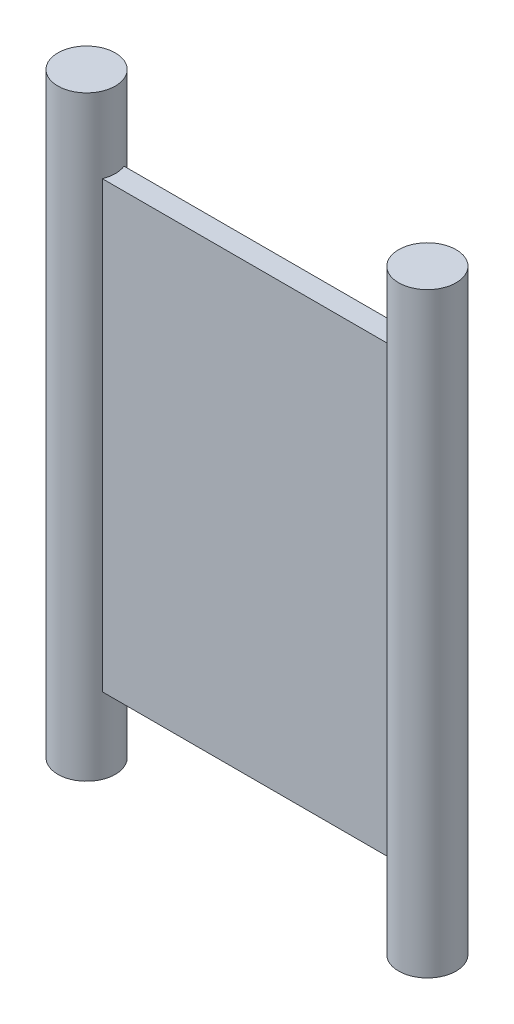
ISO-10303-21;
HEADER;
FILE_DESCRIPTION(('STEP AP214'),'2;1');
FILE_NAME('part.step','',(''),(''),'','','');
FILE_SCHEMA(('AUTOMOTIVE_DESIGN { 1 0 10303 214 1 1 1 1 }'));
ENDSEC;
DATA;
#1=APPLICATION_CONTEXT('core data for automotive mechanical design processes');
#2=APPLICATION_PROTOCOL_DEFINITION('international standard','automotive_design',2000,#1);
#3=PRODUCT_CONTEXT('',#1,'mechanical');
#4=PRODUCT('Part','Part','',(#3));
#5=PRODUCT_RELATED_PRODUCT_CATEGORY('part','',(#4));
#6=PRODUCT_DEFINITION_FORMATION('','',#4);
#7=PRODUCT_DEFINITION_CONTEXT('part definition',#1,'design');
#8=PRODUCT_DEFINITION('design','',#6,#7);
#9=PRODUCT_DEFINITION_SHAPE('','',#8);
#10=(LENGTH_UNIT() NAMED_UNIT(*) SI_UNIT(.MILLI.,.METRE.));
#11=(NAMED_UNIT(*) PLANE_ANGLE_UNIT() SI_UNIT($,.RADIAN.));
#12=(NAMED_UNIT(*) SI_UNIT($,.STERADIAN.) SOLID_ANGLE_UNIT());
#13=UNCERTAINTY_MEASURE_WITH_UNIT(LENGTH_MEASURE(1.E-05),#10,'distance_accuracy_value','');
#14=(GEOMETRIC_REPRESENTATION_CONTEXT(3) GLOBAL_UNCERTAINTY_ASSIGNED_CONTEXT((#13)) GLOBAL_UNIT_ASSIGNED_CONTEXT((#10,
#11,#12)) REPRESENTATION_CONTEXT('',''));
#15=CARTESIAN_POINT('',(0.,0.,0.));
#16=DIRECTION('',(0.,0.,1.));
#17=DIRECTION('',(1.,0.,0.));
#18=AXIS2_PLACEMENT_3D('',#15,#16,#17);
#19=CARTESIAN_POINT('',(7.86,20.5,0.499999999999999));
#20=DIRECTION('',(0.,0.,-1.));
#21=DIRECTION('',(-1.,0.,0.));
#22=AXIS2_PLACEMENT_3D('',#19,#20,#21);
#23=PLANE('',#22);
#24=DIRECTION('',(0.,-1.,0.));
#25=VECTOR('',#24,1.);
#26=CARTESIAN_POINT('',(6.6329608808192,24.,0.499999999999999));
#27=LINE('',#26,#25);
#28=CARTESIAN_POINT('',(6.6329608808192,20.5,0.499999999999999));
#29=VERTEX_POINT('',#28);
#30=CARTESIAN_POINT('',(6.6329608808192,0.,0.499999999999999));
#31=VERTEX_POINT('',#30);
#32=EDGE_CURVE('E53',#29,#31,#27,.T.);
#33=ORIENTED_EDGE('',*,*,#32,.F.);
#34=DIRECTION('',(1.,0.,0.));
#35=VECTOR('',#34,1.);
#36=CARTESIAN_POINT('',(7.86,20.5,0.499999999999999));
#37=LINE('',#36,#35);
#38=CARTESIAN_POINT('',(-6.6329608808192,20.5,0.500000000000001));
#39=VERTEX_POINT('',#38);
#40=EDGE_CURVE('E90',#39,#29,#37,.T.);
#41=ORIENTED_EDGE('',*,*,#40,.F.);
#42=DIRECTION('',(0.,-1.,0.));
#43=VECTOR('',#42,1.);
#44=CARTESIAN_POINT('',(-6.6329608808192,24.,0.500000000000001));
#45=LINE('',#44,#43);
#46=CARTESIAN_POINT('',(-6.6329608808192,0.,0.500000000000001));
#47=VERTEX_POINT('',#46);
#48=EDGE_CURVE('E103',#47,#39,#45,.F.);
#49=ORIENTED_EDGE('',*,*,#48,.F.);
#50=DIRECTION('',(1.,0.,0.));
#51=VECTOR('',#50,1.);
#52=CARTESIAN_POINT('',(7.86,0.,0.499999999999999));
#53=LINE('',#52,#51);
#54=EDGE_CURVE('E91',#47,#31,#53,.T.);
#55=ORIENTED_EDGE('',*,*,#54,.T.);
#56=EDGE_LOOP('',(#33,#41,#49,#55));
#57=FACE_BOUND('',#56,.T.);
#58=ADVANCED_FACE('F39',(#57),#23,.F.);
#59=CARTESIAN_POINT('',(7.86,20.5,-0.500000000000001));
#60=DIRECTION('',(0.,0.,1.));
#61=DIRECTION('',(1.,0.,0.));
#62=AXIS2_PLACEMENT_3D('',#59,#60,#61);
#63=PLANE('',#62);
#64=DIRECTION('',(0.,-1.,0.));
#65=VECTOR('',#64,1.);
#66=CARTESIAN_POINT('',(6.6329608808192,24.,-0.500000000000001));
#67=LINE('',#66,#65);
#68=CARTESIAN_POINT('',(6.6329608808192,0.,-0.500000000000001));
#69=VERTEX_POINT('',#68);
#70=CARTESIAN_POINT('',(6.6329608808192,20.5,-0.500000000000001));
#71=VERTEX_POINT('',#70);
#72=EDGE_CURVE('E78',#69,#71,#67,.F.);
#73=ORIENTED_EDGE('',*,*,#72,.F.);
#74=DIRECTION('',(-1.,0.,0.));
#75=VECTOR('',#74,1.);
#76=CARTESIAN_POINT('',(7.86,0.,-0.500000000000001));
#77=LINE('',#76,#75);
#78=CARTESIAN_POINT('',(-6.63296088081919,0.,-0.499999999999999));
#79=VERTEX_POINT('',#78);
#80=EDGE_CURVE('E60',#69,#79,#77,.T.);
#81=ORIENTED_EDGE('',*,*,#80,.T.);
#82=DIRECTION('',(0.,-1.,0.));
#83=VECTOR('',#82,1.);
#84=CARTESIAN_POINT('',(-6.63296088081919,24.,-0.499999999999999));
#85=LINE('',#84,#83);
#86=CARTESIAN_POINT('',(-6.63296088081919,20.5,-0.499999999999999));
#87=VERTEX_POINT('',#86);
#88=EDGE_CURVE('E105',#87,#79,#85,.T.);
#89=ORIENTED_EDGE('',*,*,#88,.F.);
#90=DIRECTION('',(-1.,0.,0.));
#91=VECTOR('',#90,1.);
#92=CARTESIAN_POINT('',(7.86,20.5,-0.500000000000001));
#93=LINE('',#92,#91);
#94=EDGE_CURVE('E85',#71,#87,#93,.T.);
#95=ORIENTED_EDGE('',*,*,#94,.F.);
#96=EDGE_LOOP('',(#73,#81,#89,#95));
#97=FACE_BOUND('',#96,.T.);
#98=ADVANCED_FACE('F84',(#97),#63,.F.);
#99=CARTESIAN_POINT('',(-7.86,24.,0.));
#100=DIRECTION('',(0.,-1.,0.));
#101=DIRECTION('',(0.,0.,-1.));
#102=AXIS2_PLACEMENT_3D('',#99,#100,#101);
#103=CYLINDRICAL_SURFACE('',#102,1.325);
#104=CARTESIAN_POINT('',(-7.86,24.,0.));
#105=DIRECTION('',(0.,1.,0.));
#106=DIRECTION('',(0.,0.,1.));
#107=AXIS2_PLACEMENT_3D('',#104,#105,#106);
#108=CIRCLE('',#107,1.325);
#109=CARTESIAN_POINT('',(-7.86,24.,1.325));
#110=VERTEX_POINT('',#109);
#111=EDGE_CURVE('E107',#110,#110,#108,.T.);
#112=ORIENTED_EDGE('',*,*,#111,.F.);
#113=EDGE_LOOP('',(#112));
#114=FACE_BOUND('',#113,.T.);
#115=CARTESIAN_POINT('',(-7.86,-3.5,0.));
#116=DIRECTION('',(0.,1.,0.));
#117=DIRECTION('',(0.,0.,1.));
#118=AXIS2_PLACEMENT_3D('',#115,#116,#117);
#119=CIRCLE('',#118,1.325);
#120=CARTESIAN_POINT('',(-7.86,-3.5,1.325));
#121=VERTEX_POINT('',#120);
#122=EDGE_CURVE('E108',#121,#121,#119,.T.);
#123=ORIENTED_EDGE('',*,*,#122,.T.);
#124=EDGE_LOOP('',(#123));
#125=FACE_BOUND('',#124,.T.);
#126=ORIENTED_EDGE('',*,*,#48,.T.);
#127=CARTESIAN_POINT('',(-7.86,20.5,0.));
#128=DIRECTION('',(0.,-1.,0.));
#129=DIRECTION('',(0.,0.,-1.));
#130=AXIS2_PLACEMENT_3D('',#127,#128,#129);
#131=CIRCLE('',#130,1.325);
#132=EDGE_CURVE('E95',#39,#87,#131,.F.);
#133=ORIENTED_EDGE('',*,*,#132,.T.);
#134=ORIENTED_EDGE('',*,*,#88,.T.);
#135=CARTESIAN_POINT('',(-7.86,0.,0.));
#136=DIRECTION('',(0.,-1.,0.));
#137=DIRECTION('',(0.,0.,-1.));
#138=AXIS2_PLACEMENT_3D('',#135,#136,#137);
#139=CIRCLE('',#138,1.325);
#140=EDGE_CURVE('E46',#47,#79,#139,.F.);
#141=ORIENTED_EDGE('',*,*,#140,.F.);
#142=EDGE_LOOP('',(#126,#133,#134,#141));
#143=FACE_BOUND('',#142,.T.);
#144=ADVANCED_FACE('F138',(#114,#125,#143),#103,.T.);
#145=CARTESIAN_POINT('',(-7.86,24.,0.));
#146=DIRECTION('',(0.,1.,0.));
#147=DIRECTION('',(0.,0.,1.));
#148=AXIS2_PLACEMENT_3D('',#145,#146,#147);
#149=PLANE('',#148);
#150=ORIENTED_EDGE('',*,*,#111,.T.);
#151=EDGE_LOOP('',(#150));
#152=FACE_BOUND('',#151,.T.);
#153=ADVANCED_FACE('F144',(#152),#149,.T.);
#154=CARTESIAN_POINT('',(-7.86,-3.5,0.));
#155=DIRECTION('',(0.,1.,0.));
#156=DIRECTION('',(0.,0.,1.));
#157=AXIS2_PLACEMENT_3D('',#154,#155,#156);
#158=PLANE('',#157);
#159=ORIENTED_EDGE('',*,*,#122,.F.);
#160=EDGE_LOOP('',(#159));
#161=FACE_BOUND('',#160,.T.);
#162=ADVANCED_FACE('F150',(#161),#158,.F.);
#163=CARTESIAN_POINT('',(0.,20.5,0.));
#164=DIRECTION('',(0.,-1.,0.));
#165=DIRECTION('',(0.,0.,-1.));
#166=AXIS2_PLACEMENT_3D('',#163,#164,#165);
#167=PLANE('',#166);
#168=CARTESIAN_POINT('',(7.86,20.5,0.));
#169=DIRECTION('',(0.,-1.,0.));
#170=DIRECTION('',(0.,0.,-1.));
#171=AXIS2_PLACEMENT_3D('',#168,#169,#170);
#172=CIRCLE('',#171,1.325);
#173=EDGE_CURVE('E111',#71,#29,#172,.F.);
#174=ORIENTED_EDGE('',*,*,#173,.F.);
#175=ORIENTED_EDGE('',*,*,#94,.T.);
#176=ORIENTED_EDGE('',*,*,#132,.F.);
#177=ORIENTED_EDGE('',*,*,#40,.T.);
#178=EDGE_LOOP('',(#174,#175,#176,#177));
#179=FACE_BOUND('',#178,.T.);
#180=ADVANCED_FACE('F141',(#179),#167,.F.);
#181=CARTESIAN_POINT('',(0.,0.,0.));
#182=DIRECTION('',(0.,-1.,0.));
#183=DIRECTION('',(0.,0.,-1.));
#184=AXIS2_PLACEMENT_3D('',#181,#182,#183);
#185=PLANE('',#184);
#186=ORIENTED_EDGE('',*,*,#80,.F.);
#187=CARTESIAN_POINT('',(7.86,0.,0.));
#188=DIRECTION('',(0.,-1.,0.));
#189=DIRECTION('',(0.,0.,-1.));
#190=AXIS2_PLACEMENT_3D('',#187,#188,#189);
#191=CIRCLE('',#190,1.325);
#192=EDGE_CURVE('E11',#69,#31,#191,.F.);
#193=ORIENTED_EDGE('',*,*,#192,.T.);
#194=ORIENTED_EDGE('',*,*,#54,.F.);
#195=ORIENTED_EDGE('',*,*,#140,.T.);
#196=EDGE_LOOP('',(#186,#193,#194,#195));
#197=FACE_BOUND('',#196,.T.);
#198=ADVANCED_FACE('F89',(#197),#185,.T.);
#199=CARTESIAN_POINT('',(7.86,24.,0.));
#200=DIRECTION('',(0.,-1.,0.));
#201=DIRECTION('',(0.,0.,-1.));
#202=AXIS2_PLACEMENT_3D('',#199,#200,#201);
#203=CYLINDRICAL_SURFACE('',#202,1.325);
#204=CARTESIAN_POINT('',(7.86,24.,0.));
#205=DIRECTION('',(0.,1.,0.));
#206=DIRECTION('',(0.,0.,1.));
#207=AXIS2_PLACEMENT_3D('',#204,#205,#206);
#208=CIRCLE('',#207,1.325);
#209=CARTESIAN_POINT('',(7.86,24.,1.325));
#210=VERTEX_POINT('',#209);
#211=EDGE_CURVE('E116',#210,#210,#208,.T.);
#212=ORIENTED_EDGE('',*,*,#211,.F.);
#213=EDGE_LOOP('',(#212));
#214=FACE_BOUND('',#213,.T.);
#215=CARTESIAN_POINT('',(7.86,-3.5,0.));
#216=DIRECTION('',(0.,1.,0.));
#217=DIRECTION('',(0.,0.,1.));
#218=AXIS2_PLACEMENT_3D('',#215,#216,#217);
#219=CIRCLE('',#218,1.325);
#220=CARTESIAN_POINT('',(7.86,-3.5,1.325));
#221=VERTEX_POINT('',#220);
#222=EDGE_CURVE('E86',#221,#221,#219,.T.);
#223=ORIENTED_EDGE('',*,*,#222,.T.);
#224=EDGE_LOOP('',(#223));
#225=FACE_BOUND('',#224,.T.);
#226=ORIENTED_EDGE('',*,*,#72,.T.);
#227=ORIENTED_EDGE('',*,*,#173,.T.);
#228=ORIENTED_EDGE('',*,*,#32,.T.);
#229=ORIENTED_EDGE('',*,*,#192,.F.);
#230=EDGE_LOOP('',(#226,#227,#228,#229));
#231=FACE_BOUND('',#230,.T.);
#232=ADVANCED_FACE('F77',(#214,#225,#231),#203,.T.);
#233=CARTESIAN_POINT('',(7.86,24.,0.));
#234=DIRECTION('',(0.,1.,0.));
#235=DIRECTION('',(0.,0.,1.));
#236=AXIS2_PLACEMENT_3D('',#233,#234,#235);
#237=PLANE('',#236);
#238=ORIENTED_EDGE('',*,*,#211,.T.);
#239=EDGE_LOOP('',(#238));
#240=FACE_BOUND('',#239,.T.);
#241=ADVANCED_FACE('F125',(#240),#237,.T.);
#242=CARTESIAN_POINT('',(7.86,-3.5,0.));
#243=DIRECTION('',(0.,1.,0.));
#244=DIRECTION('',(0.,0.,1.));
#245=AXIS2_PLACEMENT_3D('',#242,#243,#244);
#246=PLANE('',#245);
#247=ORIENTED_EDGE('',*,*,#222,.F.);
#248=EDGE_LOOP('',(#247));
#249=FACE_BOUND('',#248,.T.);
#250=ADVANCED_FACE('F123',(#249),#246,.F.);
#251=CLOSED_SHELL('',(#58,#98,#144,#153,#162,#180,#198,#232,#241,#250));
#252=MANIFOLD_SOLID_BREP('B2',#251);
#253=ADVANCED_BREP_SHAPE_REPRESENTATION('',(#18,#252),#14);
#254=SHAPE_DEFINITION_REPRESENTATION(#9,#253);
ENDSEC;
END-ISO-10303-21;
